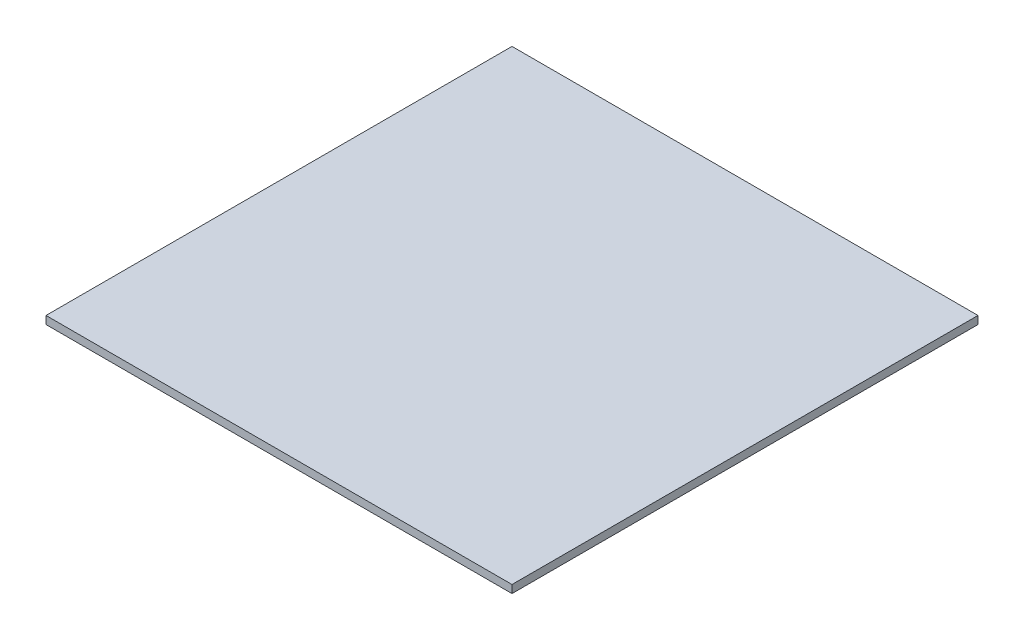
ISO-10303-21;
HEADER;
FILE_DESCRIPTION(('STEP AP214'),'2;1');
FILE_NAME('part.step','',(''),(''),'','','');
FILE_SCHEMA(('AUTOMOTIVE_DESIGN { 1 0 10303 214 1 1 1 1 }'));
ENDSEC;
DATA;
#1=APPLICATION_CONTEXT('core data for automotive mechanical design processes');
#2=APPLICATION_PROTOCOL_DEFINITION('international standard','automotive_design',2000,#1);
#3=PRODUCT_CONTEXT('',#1,'mechanical');
#4=PRODUCT('Part','Part','',(#3));
#5=PRODUCT_RELATED_PRODUCT_CATEGORY('part','',(#4));
#6=PRODUCT_DEFINITION_FORMATION('','',#4);
#7=PRODUCT_DEFINITION_CONTEXT('part definition',#1,'design');
#8=PRODUCT_DEFINITION('design','',#6,#7);
#9=PRODUCT_DEFINITION_SHAPE('','',#8);
#10=(LENGTH_UNIT() NAMED_UNIT(*) SI_UNIT(.MILLI.,.METRE.));
#11=(NAMED_UNIT(*) PLANE_ANGLE_UNIT() SI_UNIT($,.RADIAN.));
#12=(NAMED_UNIT(*) SI_UNIT($,.STERADIAN.) SOLID_ANGLE_UNIT());
#13=UNCERTAINTY_MEASURE_WITH_UNIT(LENGTH_MEASURE(1.E-05),#10,'distance_accuracy_value','');
#14=(GEOMETRIC_REPRESENTATION_CONTEXT(3) GLOBAL_UNCERTAINTY_ASSIGNED_CONTEXT((#13)) GLOBAL_UNIT_ASSIGNED_CONTEXT((#10,
#11,#12)) REPRESENTATION_CONTEXT('',''));
#15=CARTESIAN_POINT('',(0.,0.,0.));
#16=DIRECTION('',(0.,0.,1.));
#17=DIRECTION('',(1.,0.,0.));
#18=AXIS2_PLACEMENT_3D('',#15,#16,#17);
#19=CARTESIAN_POINT('',(750.,25.4,750.));
#20=DIRECTION('',(-1.,0.,0.));
#21=DIRECTION('',(0.,0.,1.));
#22=AXIS2_PLACEMENT_3D('',#19,#20,#21);
#23=PLANE('',#22);
#24=DIRECTION('',(0.,0.,-1.));
#25=VECTOR('',#24,1.);
#26=CARTESIAN_POINT('',(750.,0.,750.));
#27=LINE('',#26,#25);
#28=CARTESIAN_POINT('',(750.,0.,750.));
#29=VERTEX_POINT('',#28);
#30=CARTESIAN_POINT('',(750.,0.,-750.));
#31=VERTEX_POINT('',#30);
#32=EDGE_CURVE('E97',#29,#31,#27,.T.);
#33=ORIENTED_EDGE('',*,*,#32,.T.);
#34=DIRECTION('',(0.,-1.,0.));
#35=VECTOR('',#34,1.);
#36=CARTESIAN_POINT('',(750.,25.4,-750.));
#37=LINE('',#36,#35);
#38=CARTESIAN_POINT('',(750.,25.4,-750.));
#39=VERTEX_POINT('',#38);
#40=EDGE_CURVE('E11',#39,#31,#37,.T.);
#41=ORIENTED_EDGE('',*,*,#40,.F.);
#42=DIRECTION('',(0.,0.,-1.));
#43=VECTOR('',#42,1.);
#44=CARTESIAN_POINT('',(750.,25.4,750.));
#45=LINE('',#44,#43);
#46=CARTESIAN_POINT('',(750.,25.4,750.));
#47=VERTEX_POINT('',#46);
#48=EDGE_CURVE('E85',#47,#39,#45,.T.);
#49=ORIENTED_EDGE('',*,*,#48,.F.);
#50=DIRECTION('',(0.,-1.,0.));
#51=VECTOR('',#50,1.);
#52=CARTESIAN_POINT('',(750.,25.4,750.));
#53=LINE('',#52,#51);
#54=EDGE_CURVE('E93',#47,#29,#53,.T.);
#55=ORIENTED_EDGE('',*,*,#54,.T.);
#56=EDGE_LOOP('',(#33,#41,#49,#55));
#57=FACE_BOUND('',#56,.T.);
#58=ADVANCED_FACE('F34',(#57),#23,.F.);
#59=CARTESIAN_POINT('',(-750.,25.4,-750.));
#60=DIRECTION('',(0.,0.,1.));
#61=DIRECTION('',(1.,0.,0.));
#62=AXIS2_PLACEMENT_3D('',#59,#60,#61);
#63=PLANE('',#62);
#64=DIRECTION('',(-1.,0.,0.));
#65=VECTOR('',#64,1.);
#66=CARTESIAN_POINT('',(-750.,0.,-750.));
#67=LINE('',#66,#65);
#68=CARTESIAN_POINT('',(-750.,0.,-750.));
#69=VERTEX_POINT('',#68);
#70=EDGE_CURVE('E89',#31,#69,#67,.T.);
#71=ORIENTED_EDGE('',*,*,#70,.T.);
#72=DIRECTION('',(0.,-1.,0.));
#73=VECTOR('',#72,1.);
#74=CARTESIAN_POINT('',(-750.,25.4,-750.));
#75=LINE('',#74,#73);
#76=CARTESIAN_POINT('',(-750.,25.4,-750.));
#77=VERTEX_POINT('',#76);
#78=EDGE_CURVE('E42',#77,#69,#75,.T.);
#79=ORIENTED_EDGE('',*,*,#78,.F.);
#80=DIRECTION('',(-1.,0.,0.));
#81=VECTOR('',#80,1.);
#82=CARTESIAN_POINT('',(-750.,25.4,-750.));
#83=LINE('',#82,#81);
#84=EDGE_CURVE('E80',#39,#77,#83,.T.);
#85=ORIENTED_EDGE('',*,*,#84,.F.);
#86=ORIENTED_EDGE('',*,*,#40,.T.);
#87=EDGE_LOOP('',(#71,#79,#85,#86));
#88=FACE_BOUND('',#87,.T.);
#89=ADVANCED_FACE('F88',(#88),#63,.F.);
#90=CARTESIAN_POINT('',(-750.,25.4,750.));
#91=DIRECTION('',(1.,0.,0.));
#92=DIRECTION('',(0.,0.,-1.));
#93=AXIS2_PLACEMENT_3D('',#90,#91,#92);
#94=PLANE('',#93);
#95=DIRECTION('',(0.,0.,1.));
#96=VECTOR('',#95,1.);
#97=CARTESIAN_POINT('',(-750.,0.,750.));
#98=LINE('',#97,#96);
#99=CARTESIAN_POINT('',(-750.,0.,750.));
#100=VERTEX_POINT('',#99);
#101=EDGE_CURVE('E67',#69,#100,#98,.T.);
#102=ORIENTED_EDGE('',*,*,#101,.T.);
#103=DIRECTION('',(0.,-1.,0.));
#104=VECTOR('',#103,1.);
#105=CARTESIAN_POINT('',(-750.,25.4,750.));
#106=LINE('',#105,#104);
#107=CARTESIAN_POINT('',(-750.,25.4,750.));
#108=VERTEX_POINT('',#107);
#109=EDGE_CURVE('E90',#108,#100,#106,.T.);
#110=ORIENTED_EDGE('',*,*,#109,.F.);
#111=DIRECTION('',(0.,0.,1.));
#112=VECTOR('',#111,1.);
#113=CARTESIAN_POINT('',(-750.,25.4,750.));
#114=LINE('',#113,#112);
#115=EDGE_CURVE('E83',#77,#108,#114,.T.);
#116=ORIENTED_EDGE('',*,*,#115,.F.);
#117=ORIENTED_EDGE('',*,*,#78,.T.);
#118=EDGE_LOOP('',(#102,#110,#116,#117));
#119=FACE_BOUND('',#118,.T.);
#120=ADVANCED_FACE('F91',(#119),#94,.F.);
#121=CARTESIAN_POINT('',(-750.,25.4,750.));
#122=DIRECTION('',(0.,0.,-1.));
#123=DIRECTION('',(-1.,0.,0.));
#124=AXIS2_PLACEMENT_3D('',#121,#122,#123);
#125=PLANE('',#124);
#126=DIRECTION('',(1.,0.,0.));
#127=VECTOR('',#126,1.);
#128=CARTESIAN_POINT('',(-750.,0.,750.));
#129=LINE('',#128,#127);
#130=EDGE_CURVE('E73',#100,#29,#129,.T.);
#131=ORIENTED_EDGE('',*,*,#130,.T.);
#132=ORIENTED_EDGE('',*,*,#54,.F.);
#133=DIRECTION('',(1.,0.,0.));
#134=VECTOR('',#133,1.);
#135=CARTESIAN_POINT('',(-750.,25.4,750.));
#136=LINE('',#135,#134);
#137=EDGE_CURVE('E50',#108,#47,#136,.T.);
#138=ORIENTED_EDGE('',*,*,#137,.F.);
#139=ORIENTED_EDGE('',*,*,#109,.T.);
#140=EDGE_LOOP('',(#131,#132,#138,#139));
#141=FACE_BOUND('',#140,.T.);
#142=ADVANCED_FACE('F104',(#141),#125,.F.);
#143=CARTESIAN_POINT('',(0.,25.4,0.));
#144=DIRECTION('',(0.,-1.,0.));
#145=DIRECTION('',(0.,0.,-1.));
#146=AXIS2_PLACEMENT_3D('',#143,#144,#145);
#147=PLANE('',#146);
#148=ORIENTED_EDGE('',*,*,#48,.T.);
#149=ORIENTED_EDGE('',*,*,#84,.T.);
#150=ORIENTED_EDGE('',*,*,#115,.T.);
#151=ORIENTED_EDGE('',*,*,#137,.T.);
#152=EDGE_LOOP('',(#148,#149,#150,#151));
#153=FACE_BOUND('',#152,.T.);
#154=ADVANCED_FACE('F81',(#153),#147,.F.);
#155=CARTESIAN_POINT('',(0.,0.,0.));
#156=DIRECTION('',(0.,-1.,0.));
#157=DIRECTION('',(0.,0.,-1.));
#158=AXIS2_PLACEMENT_3D('',#155,#156,#157);
#159=PLANE('',#158);
#160=ORIENTED_EDGE('',*,*,#32,.F.);
#161=ORIENTED_EDGE('',*,*,#130,.F.);
#162=ORIENTED_EDGE('',*,*,#101,.F.);
#163=ORIENTED_EDGE('',*,*,#70,.F.);
#164=EDGE_LOOP('',(#160,#161,#162,#163));
#165=FACE_BOUND('',#164,.T.);
#166=ADVANCED_FACE('F107',(#165),#159,.T.);
#167=CLOSED_SHELL('',(#58,#89,#120,#142,#154,#166));
#168=MANIFOLD_SOLID_BREP('B2',#167);
#169=ADVANCED_BREP_SHAPE_REPRESENTATION('',(#18,#168),#14);
#170=SHAPE_DEFINITION_REPRESENTATION(#9,#169);
ENDSEC;
END-ISO-10303-21;
